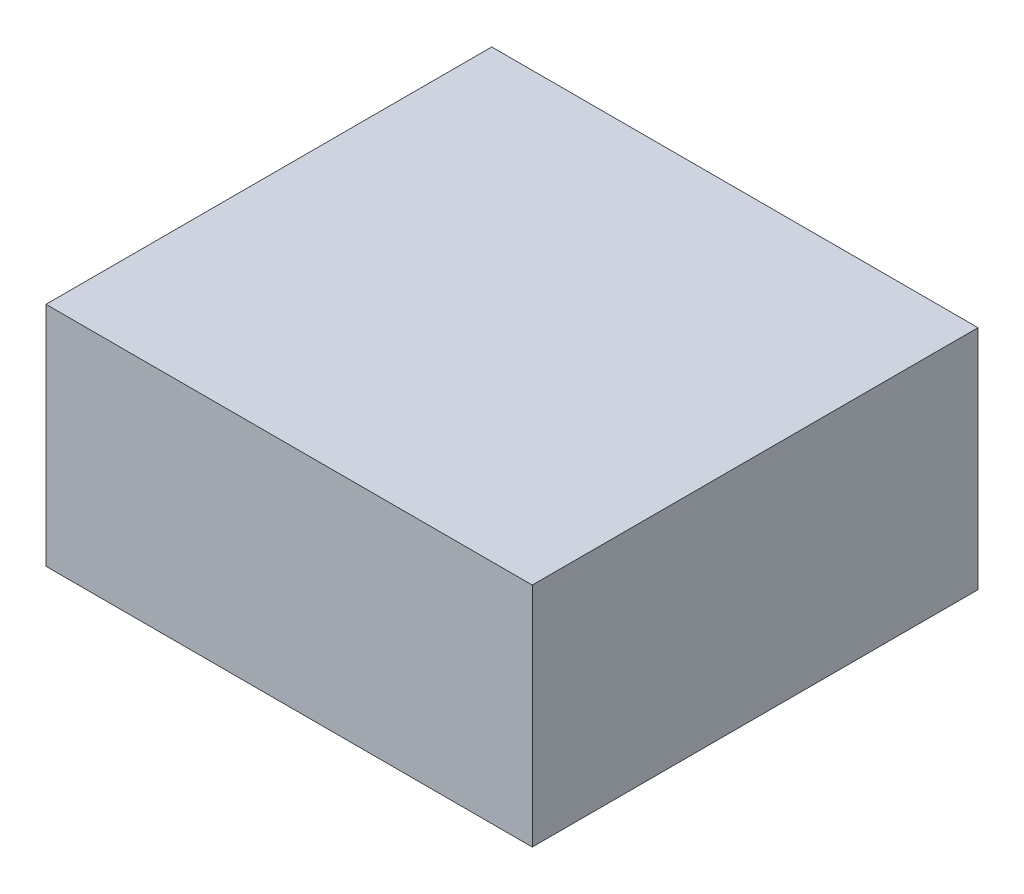
ISO-10303-21;
HEADER;
FILE_DESCRIPTION(('STEP AP214'),'2;1');
FILE_NAME('part.step','',(''),(''),'','','');
FILE_SCHEMA(('AUTOMOTIVE_DESIGN { 1 0 10303 214 1 1 1 1 }'));
ENDSEC;
DATA;
#1=APPLICATION_CONTEXT('core data for automotive mechanical design processes');
#2=APPLICATION_PROTOCOL_DEFINITION('international standard','automotive_design',2000,#1);
#3=PRODUCT_CONTEXT('',#1,'mechanical');
#4=PRODUCT('Part','Part','',(#3));
#5=PRODUCT_RELATED_PRODUCT_CATEGORY('part','',(#4));
#6=PRODUCT_DEFINITION_FORMATION('','',#4);
#7=PRODUCT_DEFINITION_CONTEXT('part definition',#1,'design');
#8=PRODUCT_DEFINITION('design','',#6,#7);
#9=PRODUCT_DEFINITION_SHAPE('','',#8);
#10=(LENGTH_UNIT() NAMED_UNIT(*) SI_UNIT(.MILLI.,.METRE.));
#11=(NAMED_UNIT(*) PLANE_ANGLE_UNIT() SI_UNIT($,.RADIAN.));
#12=(NAMED_UNIT(*) SI_UNIT($,.STERADIAN.) SOLID_ANGLE_UNIT());
#13=UNCERTAINTY_MEASURE_WITH_UNIT(LENGTH_MEASURE(1.E-05),#10,'distance_accuracy_value','');
#14=(GEOMETRIC_REPRESENTATION_CONTEXT(3) GLOBAL_UNCERTAINTY_ASSIGNED_CONTEXT((#13)) GLOBAL_UNIT_ASSIGNED_CONTEXT((#10,
#11,#12)) REPRESENTATION_CONTEXT('',''));
#15=CARTESIAN_POINT('',(0.,0.,0.));
#16=DIRECTION('',(0.,0.,1.));
#17=DIRECTION('',(1.,0.,0.));
#18=AXIS2_PLACEMENT_3D('',#15,#16,#17);
#19=CARTESIAN_POINT('',(60.,56.,-55.));
#20=DIRECTION('',(-1.,0.,0.));
#21=DIRECTION('',(0.,0.,1.));
#22=AXIS2_PLACEMENT_3D('',#19,#20,#21);
#23=PLANE('',#22);
#24=DIRECTION('',(0.,0.,-1.));
#25=VECTOR('',#24,1.);
#26=CARTESIAN_POINT('',(60.,0.,-55.));
#27=LINE('',#26,#25);
#28=CARTESIAN_POINT('',(60.,0.,55.));
#29=VERTEX_POINT('',#28);
#30=CARTESIAN_POINT('',(60.,0.,-55.));
#31=VERTEX_POINT('',#30);
#32=EDGE_CURVE('E98',#29,#31,#27,.T.);
#33=ORIENTED_EDGE('',*,*,#32,.T.);
#34=DIRECTION('',(0.,-1.,0.));
#35=VECTOR('',#34,1.);
#36=CARTESIAN_POINT('',(60.,56.,-55.));
#37=LINE('',#36,#35);
#38=CARTESIAN_POINT('',(60.,56.,-55.));
#39=VERTEX_POINT('',#38);
#40=EDGE_CURVE('E11',#39,#31,#37,.T.);
#41=ORIENTED_EDGE('',*,*,#40,.F.);
#42=DIRECTION('',(0.,0.,-1.));
#43=VECTOR('',#42,1.);
#44=CARTESIAN_POINT('',(60.,56.,-55.));
#45=LINE('',#44,#43);
#46=CARTESIAN_POINT('',(60.,56.,55.));
#47=VERTEX_POINT('',#46);
#48=EDGE_CURVE('E86',#47,#39,#45,.T.);
#49=ORIENTED_EDGE('',*,*,#48,.F.);
#50=DIRECTION('',(0.,-1.,0.));
#51=VECTOR('',#50,1.);
#52=CARTESIAN_POINT('',(60.,56.,55.));
#53=LINE('',#52,#51);
#54=EDGE_CURVE('E94',#47,#29,#53,.T.);
#55=ORIENTED_EDGE('',*,*,#54,.T.);
#56=EDGE_LOOP('',(#33,#41,#49,#55));
#57=FACE_BOUND('',#56,.T.);
#58=ADVANCED_FACE('F35',(#57),#23,.F.);
#59=CARTESIAN_POINT('',(-60.,56.,-55.));
#60=DIRECTION('',(0.,0.,1.));
#61=DIRECTION('',(1.,0.,0.));
#62=AXIS2_PLACEMENT_3D('',#59,#60,#61);
#63=PLANE('',#62);
#64=DIRECTION('',(-1.,0.,0.));
#65=VECTOR('',#64,1.);
#66=CARTESIAN_POINT('',(-60.,0.,-55.));
#67=LINE('',#66,#65);
#68=CARTESIAN_POINT('',(-60.,0.,-55.));
#69=VERTEX_POINT('',#68);
#70=EDGE_CURVE('E90',#31,#69,#67,.T.);
#71=ORIENTED_EDGE('',*,*,#70,.T.);
#72=DIRECTION('',(0.,-1.,0.));
#73=VECTOR('',#72,1.);
#74=CARTESIAN_POINT('',(-60.,56.,-55.));
#75=LINE('',#74,#73);
#76=CARTESIAN_POINT('',(-60.,56.,-55.));
#77=VERTEX_POINT('',#76);
#78=EDGE_CURVE('E43',#77,#69,#75,.T.);
#79=ORIENTED_EDGE('',*,*,#78,.F.);
#80=DIRECTION('',(-1.,0.,0.));
#81=VECTOR('',#80,1.);
#82=CARTESIAN_POINT('',(-60.,56.,-55.));
#83=LINE('',#82,#81);
#84=EDGE_CURVE('E81',#39,#77,#83,.T.);
#85=ORIENTED_EDGE('',*,*,#84,.F.);
#86=ORIENTED_EDGE('',*,*,#40,.T.);
#87=EDGE_LOOP('',(#71,#79,#85,#86));
#88=FACE_BOUND('',#87,.T.);
#89=ADVANCED_FACE('F89',(#88),#63,.F.);
#90=CARTESIAN_POINT('',(-60.,56.,-55.));
#91=DIRECTION('',(1.,0.,0.));
#92=DIRECTION('',(0.,0.,-1.));
#93=AXIS2_PLACEMENT_3D('',#90,#91,#92);
#94=PLANE('',#93);
#95=DIRECTION('',(0.,0.,1.));
#96=VECTOR('',#95,1.);
#97=CARTESIAN_POINT('',(-60.,0.,-55.));
#98=LINE('',#97,#96);
#99=CARTESIAN_POINT('',(-60.,0.,55.));
#100=VERTEX_POINT('',#99);
#101=EDGE_CURVE('E68',#69,#100,#98,.T.);
#102=ORIENTED_EDGE('',*,*,#101,.T.);
#103=DIRECTION('',(0.,-1.,0.));
#104=VECTOR('',#103,1.);
#105=CARTESIAN_POINT('',(-60.,56.,55.));
#106=LINE('',#105,#104);
#107=CARTESIAN_POINT('',(-60.,56.,55.));
#108=VERTEX_POINT('',#107);
#109=EDGE_CURVE('E91',#108,#100,#106,.T.);
#110=ORIENTED_EDGE('',*,*,#109,.F.);
#111=DIRECTION('',(0.,0.,1.));
#112=VECTOR('',#111,1.);
#113=CARTESIAN_POINT('',(-60.,56.,-55.));
#114=LINE('',#113,#112);
#115=EDGE_CURVE('E84',#77,#108,#114,.T.);
#116=ORIENTED_EDGE('',*,*,#115,.F.);
#117=ORIENTED_EDGE('',*,*,#78,.T.);
#118=EDGE_LOOP('',(#102,#110,#116,#117));
#119=FACE_BOUND('',#118,.T.);
#120=ADVANCED_FACE('F92',(#119),#94,.F.);
#121=CARTESIAN_POINT('',(-60.,56.,55.));
#122=DIRECTION('',(0.,0.,-1.));
#123=DIRECTION('',(-1.,0.,0.));
#124=AXIS2_PLACEMENT_3D('',#121,#122,#123);
#125=PLANE('',#124);
#126=DIRECTION('',(1.,0.,0.));
#127=VECTOR('',#126,1.);
#128=CARTESIAN_POINT('',(-60.,0.,55.));
#129=LINE('',#128,#127);
#130=EDGE_CURVE('E74',#100,#29,#129,.T.);
#131=ORIENTED_EDGE('',*,*,#130,.T.);
#132=ORIENTED_EDGE('',*,*,#54,.F.);
#133=DIRECTION('',(1.,0.,0.));
#134=VECTOR('',#133,1.);
#135=CARTESIAN_POINT('',(-60.,56.,55.));
#136=LINE('',#135,#134);
#137=EDGE_CURVE('E51',#108,#47,#136,.T.);
#138=ORIENTED_EDGE('',*,*,#137,.F.);
#139=ORIENTED_EDGE('',*,*,#109,.T.);
#140=EDGE_LOOP('',(#131,#132,#138,#139));
#141=FACE_BOUND('',#140,.T.);
#142=ADVANCED_FACE('F105',(#141),#125,.F.);
#143=CARTESIAN_POINT('',(0.,56.,0.));
#144=DIRECTION('',(0.,1.,0.));
#145=DIRECTION('',(0.,0.,1.));
#146=AXIS2_PLACEMENT_3D('',#143,#144,#145);
#147=PLANE('',#146);
#148=ORIENTED_EDGE('',*,*,#48,.T.);
#149=ORIENTED_EDGE('',*,*,#84,.T.);
#150=ORIENTED_EDGE('',*,*,#115,.T.);
#151=ORIENTED_EDGE('',*,*,#137,.T.);
#152=EDGE_LOOP('',(#148,#149,#150,#151));
#153=FACE_BOUND('',#152,.T.);
#154=ADVANCED_FACE('F82',(#153),#147,.T.);
#155=CARTESIAN_POINT('',(0.,0.,0.));
#156=DIRECTION('',(0.,1.,0.));
#157=DIRECTION('',(0.,0.,1.));
#158=AXIS2_PLACEMENT_3D('',#155,#156,#157);
#159=PLANE('',#158);
#160=ORIENTED_EDGE('',*,*,#32,.F.);
#161=ORIENTED_EDGE('',*,*,#130,.F.);
#162=ORIENTED_EDGE('',*,*,#101,.F.);
#163=ORIENTED_EDGE('',*,*,#70,.F.);
#164=EDGE_LOOP('',(#160,#161,#162,#163));
#165=FACE_BOUND('',#164,.T.);
#166=ADVANCED_FACE('F108',(#165),#159,.F.);
#167=CLOSED_SHELL('',(#58,#89,#120,#142,#154,#166));
#168=MANIFOLD_SOLID_BREP('B2',#167);
#169=ADVANCED_BREP_SHAPE_REPRESENTATION('',(#18,#168),#14);
#170=SHAPE_DEFINITION_REPRESENTATION(#9,#169);
ENDSEC;
END-ISO-10303-21;
